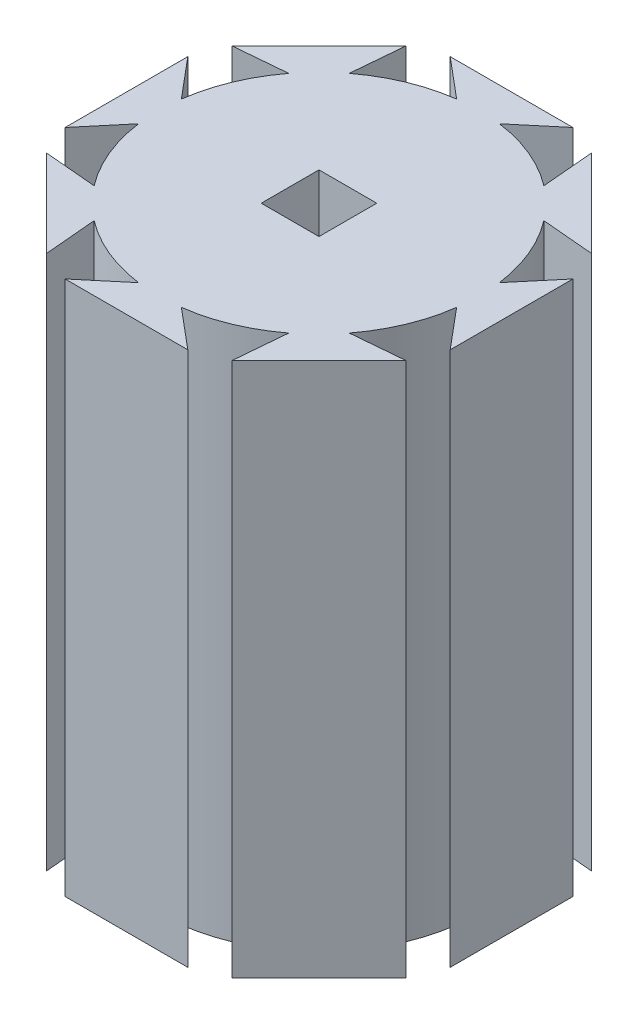
ISO-10303-21;
HEADER;
FILE_DESCRIPTION(('STEP AP214'),'2;1');
FILE_NAME('part.step','',(''),(''),'','','');
FILE_SCHEMA(('AUTOMOTIVE_DESIGN { 1 0 10303 214 1 1 1 1 }'));
ENDSEC;
DATA;
#1=APPLICATION_CONTEXT('core data for automotive mechanical design processes');
#2=APPLICATION_PROTOCOL_DEFINITION('international standard','automotive_design',2000,#1);
#3=PRODUCT_CONTEXT('',#1,'mechanical');
#4=PRODUCT('Part','Part','',(#3));
#5=PRODUCT_RELATED_PRODUCT_CATEGORY('part','',(#4));
#6=PRODUCT_DEFINITION_FORMATION('','',#4);
#7=PRODUCT_DEFINITION_CONTEXT('part definition',#1,'design');
#8=PRODUCT_DEFINITION('design','',#6,#7);
#9=PRODUCT_DEFINITION_SHAPE('','',#8);
#10=(LENGTH_UNIT() NAMED_UNIT(*) SI_UNIT(.MILLI.,.METRE.));
#11=(NAMED_UNIT(*) PLANE_ANGLE_UNIT() SI_UNIT($,.RADIAN.));
#12=(NAMED_UNIT(*) SI_UNIT($,.STERADIAN.) SOLID_ANGLE_UNIT());
#13=UNCERTAINTY_MEASURE_WITH_UNIT(LENGTH_MEASURE(1.E-05),#10,'distance_accuracy_value','');
#14=(GEOMETRIC_REPRESENTATION_CONTEXT(3) GLOBAL_UNCERTAINTY_ASSIGNED_CONTEXT((#13)) GLOBAL_UNIT_ASSIGNED_CONTEXT((#10,
#11,#12)) REPRESENTATION_CONTEXT('',''));
#15=CARTESIAN_POINT('',(0.,0.,0.));
#16=DIRECTION('',(0.,0.,1.));
#17=DIRECTION('',(1.,0.,0.));
#18=AXIS2_PLACEMENT_3D('',#15,#16,#17);
#19=CARTESIAN_POINT('',(0.,63.5,0.));
#20=DIRECTION('',(0.,-1.,0.));
#21=DIRECTION('',(0.,0.,-1.));
#22=AXIS2_PLACEMENT_3D('',#19,#20,#21);
#23=CYLINDRICAL_SURFACE('',#22,19.05);
#24=DIRECTION('',(0.,-1.,0.));
#25=VECTOR('',#24,1.);
#26=CARTESIAN_POINT('',(-15.1461617106479,78.0665795264893,-11.5540592622205));
#27=LINE('',#26,#25);
#28=CARTESIAN_POINT('',(-15.1461617106479,63.5,-11.5540592622205));
#29=VERTEX_POINT('',#28);
#30=CARTESIAN_POINT('',(-15.1461617106479,0.,-11.5540592622205));
#31=VERTEX_POINT('',#30);
#32=EDGE_CURVE('E70',#29,#31,#27,.T.);
#33=ORIENTED_EDGE('',*,*,#32,.T.);
#34=CARTESIAN_POINT('',(0.,0.,0.));
#35=DIRECTION('',(0.,1.,0.));
#36=DIRECTION('',(0.,0.,1.));
#37=AXIS2_PLACEMENT_3D('',#34,#35,#36);
#38=CIRCLE('',#37,19.05);
#39=CARTESIAN_POINT('',(-18.8799073090945,0.,-2.5400000000002));
#40=VERTEX_POINT('',#39);
#41=EDGE_CURVE('E630',#31,#40,#38,.T.);
#42=ORIENTED_EDGE('',*,*,#41,.T.);
#43=DIRECTION('',(0.,-1.,0.));
#44=VECTOR('',#43,1.);
#45=CARTESIAN_POINT('',(-18.8799073090945,78.6005422727045,-2.5400000000002));
#46=LINE('',#45,#44);
#47=CARTESIAN_POINT('',(-18.8799073090945,63.5,-2.5400000000002));
#48=VERTEX_POINT('',#47);
#49=EDGE_CURVE('E346',#48,#40,#46,.T.);
#50=ORIENTED_EDGE('',*,*,#49,.F.);
#51=CARTESIAN_POINT('',(0.,63.5,0.));
#52=DIRECTION('',(0.,1.,0.));
#53=DIRECTION('',(0.,0.,1.));
#54=AXIS2_PLACEMENT_3D('',#51,#52,#53);
#55=CIRCLE('',#54,19.05);
#56=EDGE_CURVE('E55',#29,#48,#55,.T.);
#57=ORIENTED_EDGE('',*,*,#56,.F.);
#58=EDGE_LOOP('',(#33,#42,#50,#57));
#59=FACE_BOUND('',#58,.T.);
#60=ADVANCED_FACE('F45',(#59),#23,.T.);
#61=DIRECTION('',(0.,-1.,0.));
#62=VECTOR('',#61,1.);
#63=CARTESIAN_POINT('',(-18.8799073090945,78.6005422727045,2.5399999999998));
#64=LINE('',#63,#62);
#65=CARTESIAN_POINT('',(-18.8799073090945,63.5,2.5399999999998));
#66=VERTEX_POINT('',#65);
#67=CARTESIAN_POINT('',(-18.8799073090945,0.,2.5399999999998));
#68=VERTEX_POINT('',#67);
#69=EDGE_CURVE('E354',#66,#68,#64,.T.);
#70=ORIENTED_EDGE('',*,*,#69,.T.);
#71=CARTESIAN_POINT('',(-15.1461617106481,0.,11.5540592622202));
#72=VERTEX_POINT('',#71);
#73=EDGE_CURVE('E634',#68,#72,#38,.T.);
#74=ORIENTED_EDGE('',*,*,#73,.T.);
#75=DIRECTION('',(0.,-1.,0.));
#76=VECTOR('',#75,1.);
#77=CARTESIAN_POINT('',(-15.1461617106481,78.0665795264893,11.5540592622202));
#78=LINE('',#77,#76);
#79=CARTESIAN_POINT('',(-15.1461617106481,63.5,11.5540592622202));
#80=VERTEX_POINT('',#79);
#81=EDGE_CURVE('E382',#80,#72,#78,.T.);
#82=ORIENTED_EDGE('',*,*,#81,.F.);
#83=EDGE_CURVE('E757',#66,#80,#55,.T.);
#84=ORIENTED_EDGE('',*,*,#83,.F.);
#85=EDGE_LOOP('',(#70,#74,#82,#84));
#86=FACE_BOUND('',#85,.T.);
#87=ADVANCED_FACE('F721',(#86),#23,.T.);
#88=DIRECTION('',(0.,-1.,0.));
#89=VECTOR('',#88,1.);
#90=CARTESIAN_POINT('',(-11.5540592622205,78.0665795264893,15.1461617106479));
#91=LINE('',#90,#89);
#92=CARTESIAN_POINT('',(-11.5540592622205,63.5,15.1461617106479));
#93=VERTEX_POINT('',#92);
#94=CARTESIAN_POINT('',(-11.5540592622205,0.,15.1461617106479));
#95=VERTEX_POINT('',#94);
#96=EDGE_CURVE('E390',#93,#95,#91,.T.);
#97=ORIENTED_EDGE('',*,*,#96,.T.);
#98=CARTESIAN_POINT('',(-2.54,0.,18.8799073090945));
#99=VERTEX_POINT('',#98);
#100=EDGE_CURVE('E637',#95,#99,#38,.T.);
#101=ORIENTED_EDGE('',*,*,#100,.T.);
#102=DIRECTION('',(0.,-1.,0.));
#103=VECTOR('',#102,1.);
#104=CARTESIAN_POINT('',(-2.54,78.6005422727045,18.8799073090945));
#105=LINE('',#104,#103);
#106=CARTESIAN_POINT('',(-2.54,63.5,18.8799073090945));
#107=VERTEX_POINT('',#106);
#108=EDGE_CURVE('E418',#107,#99,#105,.T.);
#109=ORIENTED_EDGE('',*,*,#108,.F.);
#110=EDGE_CURVE('E679',#93,#107,#55,.T.);
#111=ORIENTED_EDGE('',*,*,#110,.F.);
#112=EDGE_LOOP('',(#97,#101,#109,#111));
#113=FACE_BOUND('',#112,.T.);
#114=ADVANCED_FACE('F735',(#113),#23,.T.);
#115=DIRECTION('',(0.,-1.,0.));
#116=VECTOR('',#115,1.);
#117=CARTESIAN_POINT('',(2.54,78.6005422727045,18.8799073090945));
#118=LINE('',#117,#116);
#119=CARTESIAN_POINT('',(2.54,63.5,18.8799073090945));
#120=VERTEX_POINT('',#119);
#121=CARTESIAN_POINT('',(2.54,0.,18.8799073090945));
#122=VERTEX_POINT('',#121);
#123=EDGE_CURVE('E426',#120,#122,#118,.T.);
#124=ORIENTED_EDGE('',*,*,#123,.T.);
#125=CARTESIAN_POINT('',(11.5540592622203,0.,15.1461617106481));
#126=VERTEX_POINT('',#125);
#127=EDGE_CURVE('E642',#122,#126,#38,.T.);
#128=ORIENTED_EDGE('',*,*,#127,.T.);
#129=DIRECTION('',(0.,-1.,0.));
#130=VECTOR('',#129,1.);
#131=CARTESIAN_POINT('',(11.5540592622203,78.0665795264893,15.1461617106481));
#132=LINE('',#131,#130);
#133=CARTESIAN_POINT('',(11.5540592622203,63.5,15.1461617106481));
#134=VERTEX_POINT('',#133);
#135=EDGE_CURVE('E454',#134,#126,#132,.T.);
#136=ORIENTED_EDGE('',*,*,#135,.F.);
#137=EDGE_CURVE('E676',#120,#134,#55,.T.);
#138=ORIENTED_EDGE('',*,*,#137,.F.);
#139=EDGE_LOOP('',(#124,#128,#136,#138));
#140=FACE_BOUND('',#139,.T.);
#141=ADVANCED_FACE('F731',(#140),#23,.T.);
#142=DIRECTION('',(0.,-1.,0.));
#143=VECTOR('',#142,1.);
#144=CARTESIAN_POINT('',(15.146161710648,78.0665795264893,11.5540592622204));
#145=LINE('',#144,#143);
#146=CARTESIAN_POINT('',(15.146161710648,63.5,11.5540592622204));
#147=VERTEX_POINT('',#146);
#148=CARTESIAN_POINT('',(15.146161710648,0.,11.5540592622204));
#149=VERTEX_POINT('',#148);
#150=EDGE_CURVE('E462',#147,#149,#145,.T.);
#151=ORIENTED_EDGE('',*,*,#150,.T.);
#152=CARTESIAN_POINT('',(18.8799073090945,0.,2.54000000000007));
#153=VERTEX_POINT('',#152);
#154=EDGE_CURVE('E628',#149,#153,#38,.T.);
#155=ORIENTED_EDGE('',*,*,#154,.T.);
#156=DIRECTION('',(0.,-1.,0.));
#157=VECTOR('',#156,1.);
#158=CARTESIAN_POINT('',(18.8799073090945,78.6005422727045,2.54000000000007));
#159=LINE('',#158,#157);
#160=CARTESIAN_POINT('',(18.8799073090945,63.5,2.54000000000007));
#161=VERTEX_POINT('',#160);
#162=EDGE_CURVE('E490',#161,#153,#159,.T.);
#163=ORIENTED_EDGE('',*,*,#162,.F.);
#164=EDGE_CURVE('E673',#147,#161,#55,.T.);
#165=ORIENTED_EDGE('',*,*,#164,.F.);
#166=EDGE_LOOP('',(#151,#155,#163,#165));
#167=FACE_BOUND('',#166,.T.);
#168=ADVANCED_FACE('F654',(#167),#23,.T.);
#169=DIRECTION('',(0.,-1.,0.));
#170=VECTOR('',#169,1.);
#171=CARTESIAN_POINT('',(18.8799073090945,78.6005422727045,-2.53999999999994));
#172=LINE('',#171,#170);
#173=CARTESIAN_POINT('',(18.8799073090945,63.5,-2.53999999999994));
#174=VERTEX_POINT('',#173);
#175=CARTESIAN_POINT('',(18.8799073090945,0.,-2.53999999999994));
#176=VERTEX_POINT('',#175);
#177=EDGE_CURVE('E498',#174,#176,#172,.T.);
#178=ORIENTED_EDGE('',*,*,#177,.T.);
#179=CARTESIAN_POINT('',(15.146161710648,0.,-11.5540592622203));
#180=VERTEX_POINT('',#179);
#181=EDGE_CURVE('E623',#176,#180,#38,.T.);
#182=ORIENTED_EDGE('',*,*,#181,.T.);
#183=DIRECTION('',(0.,-1.,0.));
#184=VECTOR('',#183,1.);
#185=CARTESIAN_POINT('',(15.146161710648,78.0665795264893,-11.5540592622203));
#186=LINE('',#185,#184);
#187=CARTESIAN_POINT('',(15.146161710648,63.5,-11.5540592622203));
#188=VERTEX_POINT('',#187);
#189=EDGE_CURVE('E526',#188,#180,#186,.T.);
#190=ORIENTED_EDGE('',*,*,#189,.F.);
#191=EDGE_CURVE('E633',#174,#188,#55,.T.);
#192=ORIENTED_EDGE('',*,*,#191,.F.);
#193=EDGE_LOOP('',(#178,#182,#190,#192));
#194=FACE_BOUND('',#193,.T.);
#195=ADVANCED_FACE('F683',(#194),#23,.T.);
#196=DIRECTION('',(0.,-1.,0.));
#197=VECTOR('',#196,1.);
#198=CARTESIAN_POINT('',(11.5540592622204,78.0665795264893,-15.146161710648));
#199=LINE('',#198,#197);
#200=CARTESIAN_POINT('',(11.5540592622204,63.5,-15.146161710648));
#201=VERTEX_POINT('',#200);
#202=CARTESIAN_POINT('',(11.5540592622204,0.,-15.146161710648));
#203=VERTEX_POINT('',#202);
#204=EDGE_CURVE('E534',#201,#203,#199,.T.);
#205=ORIENTED_EDGE('',*,*,#204,.T.);
#206=CARTESIAN_POINT('',(2.54,0.,-18.8799073090945));
#207=VERTEX_POINT('',#206);
#208=EDGE_CURVE('E619',#203,#207,#38,.T.);
#209=ORIENTED_EDGE('',*,*,#208,.T.);
#210=DIRECTION('',(0.,-1.,0.));
#211=VECTOR('',#210,1.);
#212=CARTESIAN_POINT('',(2.54,78.6005422727045,-18.8799073090945));
#213=LINE('',#212,#211);
#214=CARTESIAN_POINT('',(2.54,63.5,-18.8799073090945));
#215=VERTEX_POINT('',#214);
#216=EDGE_CURVE('E562',#215,#207,#213,.T.);
#217=ORIENTED_EDGE('',*,*,#216,.F.);
#218=EDGE_CURVE('E56',#201,#215,#55,.T.);
#219=ORIENTED_EDGE('',*,*,#218,.F.);
#220=EDGE_LOOP('',(#205,#209,#217,#219));
#221=FACE_BOUND('',#220,.T.);
#222=ADVANCED_FACE('F698',(#221),#23,.T.);
#223=CARTESIAN_POINT('',(0.,63.5,0.));
#224=DIRECTION('',(0.,1.,0.));
#225=DIRECTION('',(0.,0.,1.));
#226=AXIS2_PLACEMENT_3D('',#223,#224,#225);
#227=PLANE('',#226);
#228=CARTESIAN_POINT('',(-2.54,63.5,-18.8799073090945));
#229=VERTEX_POINT('',#228);
#230=CARTESIAN_POINT('',(-11.5540592622202,63.5,-15.1461617106482));
#231=VERTEX_POINT('',#230);
#232=EDGE_CURVE('E11',#229,#231,#55,.T.);
#233=ORIENTED_EDGE('',*,*,#232,.T.);
#234=DIRECTION('',(-0.0871557427476764,0.,0.996194698091744));
#235=VECTOR('',#234,1.);
#236=CARTESIAN_POINT('',(-12.7813448910601,63.5,-1.11822278258298));
#237=LINE('',#236,#235);
#238=CARTESIAN_POINT('',(-11.0143974369874,63.5,-21.3145245988614));
#239=VERTEX_POINT('',#238);
#240=EDGE_CURVE('E306',#239,#231,#237,.T.);
#241=ORIENTED_EDGE('',*,*,#240,.F.);
#242=DIRECTION('',(-0.707106781186556,0.,0.707106781186539));
#243=VECTOR('',#242,1.);
#244=CARTESIAN_POINT('',(-16.1644610179243,63.5,-16.1644610179247));
#245=LINE('',#244,#243);
#246=CARTESIAN_POINT('',(-21.3145245988612,63.5,-11.0143974369879));
#247=VERTEX_POINT('',#246);
#248=EDGE_CURVE('E286',#239,#247,#245,.T.);
#249=ORIENTED_EDGE('',*,*,#248,.T.);
#250=DIRECTION('',(0.996194698091746,0.,-0.0871557427476522));
#251=VECTOR('',#250,1.);
#252=CARTESIAN_POINT('',(-1.11822278258267,63.5,-12.7813448910602));
#253=LINE('',#252,#251);
#254=EDGE_CURVE('E307',#247,#29,#253,.T.);
#255=ORIENTED_EDGE('',*,*,#254,.T.);
#256=ORIENTED_EDGE('',*,*,#56,.T.);
#257=DIRECTION('',(0.642787609686527,0.,0.766044443118989));
#258=VECTOR('',#257,1.);
#259=CARTESIAN_POINT('',(-9.82847855759436,63.5,8.24707273271096));
#260=LINE('',#259,#258);
#261=CARTESIAN_POINT('',(-22.8599999999999,63.5,-7.28328976324487));
#262=VERTEX_POINT('',#261);
#263=EDGE_CURVE('E330',#262,#48,#260,.T.);
#264=ORIENTED_EDGE('',*,*,#263,.F.);
#265=DIRECTION('',(0.,0.,1.));
#266=VECTOR('',#265,1.);
#267=CARTESIAN_POINT('',(-22.86,63.5,-2.39445790217862E-13));
#268=LINE('',#267,#266);
#269=CARTESIAN_POINT('',(-22.8600000000001,63.5,7.28328976324439));
#270=VERTEX_POINT('',#269);
#271=EDGE_CURVE('E302',#262,#270,#268,.T.);
#272=ORIENTED_EDGE('',*,*,#271,.T.);
#273=DIRECTION('',(0.642787609686543,0.,-0.766044443118975));
#274=VECTOR('',#273,1.);
#275=CARTESIAN_POINT('',(-9.82847855759419,63.5,-8.24707273271116));
#276=LINE('',#275,#274);
#277=EDGE_CURVE('E331',#270,#66,#276,.T.);
#278=ORIENTED_EDGE('',*,*,#277,.T.);
#279=ORIENTED_EDGE('',*,*,#83,.T.);
#280=DIRECTION('',(0.996194698091744,0.,0.087155742747673));
#281=VECTOR('',#280,1.);
#282=CARTESIAN_POINT('',(-1.11822278258294,63.5,12.7813448910601));
#283=LINE('',#282,#281);
#284=CARTESIAN_POINT('',(-21.3145245988614,63.5,11.0143974369874));
#285=VERTEX_POINT('',#284);
#286=EDGE_CURVE('E366',#285,#80,#283,.T.);
#287=ORIENTED_EDGE('',*,*,#286,.F.);
#288=DIRECTION('',(0.707106781186541,0.,0.707106781186554));
#289=VECTOR('',#288,1.);
#290=CARTESIAN_POINT('',(-16.1644610179246,63.5,16.1644610179243));
#291=LINE('',#290,#289);
#292=CARTESIAN_POINT('',(-11.0143974369878,63.5,21.3145245988612));
#293=VERTEX_POINT('',#292);
#294=EDGE_CURVE('E342',#285,#293,#291,.T.);
#295=ORIENTED_EDGE('',*,*,#294,.T.);
#296=DIRECTION('',(-0.0871557427476557,0.,-0.996194698091746));
#297=VECTOR('',#296,1.);
#298=CARTESIAN_POINT('',(-12.7813448910602,63.5,1.11822278258272));
#299=LINE('',#298,#297);
#300=EDGE_CURVE('E367',#293,#93,#299,.T.);
#301=ORIENTED_EDGE('',*,*,#300,.T.);
#302=ORIENTED_EDGE('',*,*,#110,.T.);
#303=DIRECTION('',(0.766044443118982,0.,-0.642787609686535));
#304=VECTOR('',#303,1.);
#305=CARTESIAN_POINT('',(8.24707273271106,63.5,9.82847855759428));
#306=LINE('',#305,#304);
#307=CARTESIAN_POINT('',(-7.28328976324463,63.5,22.86));
#308=VERTEX_POINT('',#307);
#309=EDGE_CURVE('E402',#308,#107,#306,.T.);
#310=ORIENTED_EDGE('',*,*,#309,.F.);
#311=DIRECTION('',(1.,0.,0.));
#312=VECTOR('',#311,1.);
#313=CARTESIAN_POINT('',(0.,63.5,22.86));
#314=LINE('',#313,#312);
#315=CARTESIAN_POINT('',(7.28328976324463,63.5,22.86));
#316=VERTEX_POINT('',#315);
#317=EDGE_CURVE('E378',#308,#316,#314,.T.);
#318=ORIENTED_EDGE('',*,*,#317,.T.);
#319=DIRECTION('',(-0.766044443118982,0.,-0.642787609686535));
#320=VECTOR('',#319,1.);
#321=CARTESIAN_POINT('',(-8.24707273271106,63.5,9.82847855759428));
#322=LINE('',#321,#320);
#323=EDGE_CURVE('E403',#316,#120,#322,.T.);
#324=ORIENTED_EDGE('',*,*,#323,.T.);
#325=ORIENTED_EDGE('',*,*,#137,.T.);
#326=DIRECTION('',(0.0871557427476696,0.,-0.996194698091745));
#327=VECTOR('',#326,1.);
#328=CARTESIAN_POINT('',(12.7813448910601,63.5,1.1182227825829));
#329=LINE('',#328,#327);
#330=CARTESIAN_POINT('',(11.0143974369875,63.5,21.3145245988614));
#331=VERTEX_POINT('',#330);
#332=EDGE_CURVE('E438',#331,#134,#329,.T.);
#333=ORIENTED_EDGE('',*,*,#332,.F.);
#334=DIRECTION('',(0.707106781186551,0.,-0.707106781186544));
#335=VECTOR('',#334,1.);
#336=CARTESIAN_POINT('',(16.1644610179244,63.5,16.1644610179246));
#337=LINE('',#336,#335);
#338=CARTESIAN_POINT('',(21.3145245988613,63.5,11.0143974369877));
#339=VERTEX_POINT('',#338);
#340=EDGE_CURVE('E414',#331,#339,#337,.T.);
#341=ORIENTED_EDGE('',*,*,#340,.T.);
#342=DIRECTION('',(-0.996194698091745,0.,0.087155742747659));
#343=VECTOR('',#342,1.);
#344=CARTESIAN_POINT('',(1.11822278258276,63.5,12.7813448910602));
#345=LINE('',#344,#343);
#346=EDGE_CURVE('E439',#339,#147,#345,.T.);
#347=ORIENTED_EDGE('',*,*,#346,.T.);
#348=ORIENTED_EDGE('',*,*,#164,.T.);
#349=DIRECTION('',(-0.642787609686532,0.,-0.766044443118984));
#350=VECTOR('',#349,1.);
#351=CARTESIAN_POINT('',(9.8284785575943,63.5,-8.24707273271102));
#352=LINE('',#351,#350);
#353=CARTESIAN_POINT('',(22.86,63.5,7.28328976324471));
#354=VERTEX_POINT('',#353);
#355=EDGE_CURVE('E474',#354,#161,#352,.T.);
#356=ORIENTED_EDGE('',*,*,#355,.F.);
#357=DIRECTION('',(0.,0.,-1.));
#358=VECTOR('',#357,1.);
#359=CARTESIAN_POINT('',(22.86,63.5,0.));
#360=LINE('',#359,#358);
#361=CARTESIAN_POINT('',(22.86,63.5,-7.28328976324455));
#362=VERTEX_POINT('',#361);
#363=EDGE_CURVE('E450',#354,#362,#360,.T.);
#364=ORIENTED_EDGE('',*,*,#363,.T.);
#365=DIRECTION('',(-0.642787609686537,0.,0.76604444311898));
#366=VECTOR('',#365,1.);
#367=CARTESIAN_POINT('',(9.82847855759425,63.5,8.24707273271109));
#368=LINE('',#367,#366);
#369=EDGE_CURVE('E475',#362,#174,#368,.T.);
#370=ORIENTED_EDGE('',*,*,#369,.T.);
#371=ORIENTED_EDGE('',*,*,#191,.T.);
#372=DIRECTION('',(-0.996194698091745,0.,-0.0871557427476661));
#373=VECTOR('',#372,1.);
#374=CARTESIAN_POINT('',(1.11822278258285,63.5,-12.7813448910601));
#375=LINE('',#374,#373);
#376=CARTESIAN_POINT('',(21.3145245988613,63.5,-11.0143974369876));
#377=VERTEX_POINT('',#376);
#378=EDGE_CURVE('E510',#377,#188,#375,.T.);
#379=ORIENTED_EDGE('',*,*,#378,.F.);
#380=DIRECTION('',(-0.707106781186546,0.,-0.707106781186549));
#381=VECTOR('',#380,1.);
#382=CARTESIAN_POINT('',(16.1644610179245,63.5,-16.1644610179244));
#383=LINE('',#382,#381);
#384=CARTESIAN_POINT('',(11.0143974369877,63.5,-21.3145245988613));
#385=VERTEX_POINT('',#384);
#386=EDGE_CURVE('E486',#377,#385,#383,.T.);
#387=ORIENTED_EDGE('',*,*,#386,.T.);
#388=DIRECTION('',(0.0871557427476626,0.,0.996194698091745));
#389=VECTOR('',#388,1.);
#390=CARTESIAN_POINT('',(12.7813448910602,63.5,-1.11822278258281));
#391=LINE('',#390,#389);
#392=EDGE_CURVE('E511',#385,#201,#391,.T.);
#393=ORIENTED_EDGE('',*,*,#392,.T.);
#394=ORIENTED_EDGE('',*,*,#218,.T.);
#395=DIRECTION('',(-0.766044443118982,0.,0.642787609686535));
#396=VECTOR('',#395,1.);
#397=CARTESIAN_POINT('',(-8.24707273271106,63.5,-9.82847855759428));
#398=LINE('',#397,#396);
#399=CARTESIAN_POINT('',(7.28328976324463,63.5,-22.86));
#400=VERTEX_POINT('',#399);
#401=EDGE_CURVE('E546',#400,#215,#398,.T.);
#402=ORIENTED_EDGE('',*,*,#401,.F.);
#403=DIRECTION('',(-1.,0.,0.));
#404=VECTOR('',#403,1.);
#405=CARTESIAN_POINT('',(0.,63.5,-22.86));
#406=LINE('',#405,#404);
#407=CARTESIAN_POINT('',(-7.28328976324463,63.5,-22.86));
#408=VERTEX_POINT('',#407);
#409=EDGE_CURVE('E522',#400,#408,#406,.T.);
#410=ORIENTED_EDGE('',*,*,#409,.T.);
#411=DIRECTION('',(0.766044443118982,0.,0.642787609686535));
#412=VECTOR('',#411,1.);
#413=CARTESIAN_POINT('',(8.24707273271106,63.5,-9.82847855759428));
#414=LINE('',#413,#412);
#415=EDGE_CURVE('E547',#408,#229,#414,.T.);
#416=ORIENTED_EDGE('',*,*,#415,.T.);
#417=EDGE_LOOP('',(#233,#241,#249,#255,#256,#264,#272,#278,#279,#287,#295,#301,#302,#310,#318,
#324,#325,#333,#341,#347,#348,#356,#364,#370,#371,#379,#387,#393,#394,#402,#410,#416));
#418=FACE_BOUND('',#417,.T.);
#419=DIRECTION('',(-1.,0.,0.));
#420=VECTOR('',#419,1.);
#421=CARTESIAN_POINT('',(-3.429,63.5,-3.429));
#422=LINE('',#421,#420);
#423=CARTESIAN_POINT('',(3.429,63.5,-3.429));
#424=VERTEX_POINT('',#423);
#425=CARTESIAN_POINT('',(-3.429,63.5,-3.429));
#426=VERTEX_POINT('',#425);
#427=EDGE_CURVE('E581',#424,#426,#422,.T.);
#428=ORIENTED_EDGE('',*,*,#427,.F.);
#429=DIRECTION('',(0.,0.,-1.));
#430=VECTOR('',#429,1.);
#431=CARTESIAN_POINT('',(3.429,63.5,3.429));
#432=LINE('',#431,#430);
#433=CARTESIAN_POINT('',(3.429,63.5,3.429));
#434=VERTEX_POINT('',#433);
#435=EDGE_CURVE('E578',#434,#424,#432,.T.);
#436=ORIENTED_EDGE('',*,*,#435,.F.);
#437=DIRECTION('',(1.,0.,0.));
#438=VECTOR('',#437,1.);
#439=CARTESIAN_POINT('',(-3.429,63.5,3.429));
#440=LINE('',#439,#438);
#441=CARTESIAN_POINT('',(-3.429,63.5,3.429));
#442=VERTEX_POINT('',#441);
#443=EDGE_CURVE('E589',#442,#434,#440,.T.);
#444=ORIENTED_EDGE('',*,*,#443,.F.);
#445=DIRECTION('',(0.,0.,1.));
#446=VECTOR('',#445,1.);
#447=CARTESIAN_POINT('',(-3.429,63.5,3.429));
#448=LINE('',#447,#446);
#449=EDGE_CURVE('E585',#426,#442,#448,.T.);
#450=ORIENTED_EDGE('',*,*,#449,.F.);
#451=EDGE_LOOP('',(#428,#436,#444,#450));
#452=FACE_BOUND('',#451,.T.);
#453=ADVANCED_FACE('F670',(#418,#452),#227,.T.);
#454=CARTESIAN_POINT('',(0.,0.,0.));
#455=DIRECTION('',(0.,1.,0.));
#456=DIRECTION('',(0.,0.,1.));
#457=AXIS2_PLACEMENT_3D('',#454,#455,#456);
#458=PLANE('',#457);
#459=CARTESIAN_POINT('',(-2.54,0.,-18.8799073090945));
#460=VERTEX_POINT('',#459);
#461=CARTESIAN_POINT('',(-11.5540592622202,0.,-15.1461617106482));
#462=VERTEX_POINT('',#461);
#463=EDGE_CURVE('E49',#460,#462,#38,.T.);
#464=ORIENTED_EDGE('',*,*,#463,.F.);
#465=DIRECTION('',(0.766044443118982,0.,0.642787609686535));
#466=VECTOR('',#465,1.);
#467=CARTESIAN_POINT('',(8.24707273271106,0.,-9.82847855759428));
#468=LINE('',#467,#466);
#469=CARTESIAN_POINT('',(-7.28328976324463,0.,-22.86));
#470=VERTEX_POINT('',#469);
#471=EDGE_CURVE('E548',#470,#460,#468,.T.);
#472=ORIENTED_EDGE('',*,*,#471,.F.);
#473=DIRECTION('',(-1.,0.,0.));
#474=VECTOR('',#473,1.);
#475=CARTESIAN_POINT('',(0.,0.,-22.86));
#476=LINE('',#475,#474);
#477=CARTESIAN_POINT('',(7.28328976324463,0.,-22.86));
#478=VERTEX_POINT('',#477);
#479=EDGE_CURVE('E554',#478,#470,#476,.T.);
#480=ORIENTED_EDGE('',*,*,#479,.F.);
#481=DIRECTION('',(-0.766044443118982,0.,0.642787609686535));
#482=VECTOR('',#481,1.);
#483=CARTESIAN_POINT('',(-8.24707273271106,0.,-9.82847855759428));
#484=LINE('',#483,#482);
#485=EDGE_CURVE('E542',#478,#207,#484,.T.);
#486=ORIENTED_EDGE('',*,*,#485,.T.);
#487=ORIENTED_EDGE('',*,*,#208,.F.);
#488=DIRECTION('',(0.0871557427476626,0.,0.996194698091745));
#489=VECTOR('',#488,1.);
#490=CARTESIAN_POINT('',(12.7813448910602,0.,-1.11822278258281));
#491=LINE('',#490,#489);
#492=CARTESIAN_POINT('',(11.0143974369877,0.,-21.3145245988613));
#493=VERTEX_POINT('',#492);
#494=EDGE_CURVE('E512',#493,#203,#491,.T.);
#495=ORIENTED_EDGE('',*,*,#494,.F.);
#496=DIRECTION('',(-0.707106781186546,0.,-0.707106781186549));
#497=VECTOR('',#496,1.);
#498=CARTESIAN_POINT('',(16.1644610179245,0.,-16.1644610179244));
#499=LINE('',#498,#497);
#500=CARTESIAN_POINT('',(21.3145245988613,0.,-11.0143974369876));
#501=VERTEX_POINT('',#500);
#502=EDGE_CURVE('E518',#501,#493,#499,.T.);
#503=ORIENTED_EDGE('',*,*,#502,.F.);
#504=DIRECTION('',(-0.996194698091745,0.,-0.0871557427476661));
#505=VECTOR('',#504,1.);
#506=CARTESIAN_POINT('',(1.11822278258285,0.,-12.7813448910601));
#507=LINE('',#506,#505);
#508=EDGE_CURVE('E506',#501,#180,#507,.T.);
#509=ORIENTED_EDGE('',*,*,#508,.T.);
#510=ORIENTED_EDGE('',*,*,#181,.F.);
#511=DIRECTION('',(-0.642787609686537,0.,0.76604444311898));
#512=VECTOR('',#511,1.);
#513=CARTESIAN_POINT('',(9.82847855759425,0.,8.24707273271109));
#514=LINE('',#513,#512);
#515=CARTESIAN_POINT('',(22.86,0.,-7.28328976324455));
#516=VERTEX_POINT('',#515);
#517=EDGE_CURVE('E476',#516,#176,#514,.T.);
#518=ORIENTED_EDGE('',*,*,#517,.F.);
#519=DIRECTION('',(0.,0.,-1.));
#520=VECTOR('',#519,1.);
#521=CARTESIAN_POINT('',(22.86,0.,0.));
#522=LINE('',#521,#520);
#523=CARTESIAN_POINT('',(22.86,0.,7.28328976324471));
#524=VERTEX_POINT('',#523);
#525=EDGE_CURVE('E482',#524,#516,#522,.T.);
#526=ORIENTED_EDGE('',*,*,#525,.F.);
#527=DIRECTION('',(-0.642787609686532,0.,-0.766044443118984));
#528=VECTOR('',#527,1.);
#529=CARTESIAN_POINT('',(9.8284785575943,0.,-8.24707273271102));
#530=LINE('',#529,#528);
#531=EDGE_CURVE('E470',#524,#153,#530,.T.);
#532=ORIENTED_EDGE('',*,*,#531,.T.);
#533=ORIENTED_EDGE('',*,*,#154,.F.);
#534=DIRECTION('',(-0.996194698091746,0.,0.087155742747659));
#535=VECTOR('',#534,1.);
#536=CARTESIAN_POINT('',(1.11822278258276,0.,12.7813448910602));
#537=LINE('',#536,#535);
#538=CARTESIAN_POINT('',(21.3145245988613,0.,11.0143974369877));
#539=VERTEX_POINT('',#538);
#540=EDGE_CURVE('E440',#539,#149,#537,.T.);
#541=ORIENTED_EDGE('',*,*,#540,.F.);
#542=DIRECTION('',(0.707106781186551,0.,-0.707106781186544));
#543=VECTOR('',#542,1.);
#544=CARTESIAN_POINT('',(16.1644610179244,0.,16.1644610179246));
#545=LINE('',#544,#543);
#546=CARTESIAN_POINT('',(11.0143974369875,0.,21.3145245988614));
#547=VERTEX_POINT('',#546);
#548=EDGE_CURVE('E446',#547,#539,#545,.T.);
#549=ORIENTED_EDGE('',*,*,#548,.F.);
#550=DIRECTION('',(0.0871557427476696,0.,-0.996194698091745));
#551=VECTOR('',#550,1.);
#552=CARTESIAN_POINT('',(12.7813448910601,0.,1.1182227825829));
#553=LINE('',#552,#551);
#554=EDGE_CURVE('E434',#547,#126,#553,.T.);
#555=ORIENTED_EDGE('',*,*,#554,.T.);
#556=ORIENTED_EDGE('',*,*,#127,.F.);
#557=DIRECTION('',(-0.766044443118982,0.,-0.642787609686535));
#558=VECTOR('',#557,1.);
#559=CARTESIAN_POINT('',(-8.24707273271106,0.,9.82847855759428));
#560=LINE('',#559,#558);
#561=CARTESIAN_POINT('',(7.28328976324463,0.,22.86));
#562=VERTEX_POINT('',#561);
#563=EDGE_CURVE('E404',#562,#122,#560,.T.);
#564=ORIENTED_EDGE('',*,*,#563,.F.);
#565=DIRECTION('',(1.,0.,0.));
#566=VECTOR('',#565,1.);
#567=CARTESIAN_POINT('',(0.,0.,22.86));
#568=LINE('',#567,#566);
#569=CARTESIAN_POINT('',(-7.28328976324463,0.,22.86));
#570=VERTEX_POINT('',#569);
#571=EDGE_CURVE('E410',#570,#562,#568,.T.);
#572=ORIENTED_EDGE('',*,*,#571,.F.);
#573=DIRECTION('',(0.766044443118982,0.,-0.642787609686535));
#574=VECTOR('',#573,1.);
#575=CARTESIAN_POINT('',(8.24707273271106,0.,9.82847855759428));
#576=LINE('',#575,#574);
#577=EDGE_CURVE('E398',#570,#99,#576,.T.);
#578=ORIENTED_EDGE('',*,*,#577,.T.);
#579=ORIENTED_EDGE('',*,*,#100,.F.);
#580=DIRECTION('',(-0.0871557427476557,0.,-0.996194698091746));
#581=VECTOR('',#580,1.);
#582=CARTESIAN_POINT('',(-12.7813448910602,0.,1.11822278258272));
#583=LINE('',#582,#581);
#584=CARTESIAN_POINT('',(-11.0143974369878,0.,21.3145245988612));
#585=VERTEX_POINT('',#584);
#586=EDGE_CURVE('E368',#585,#95,#583,.T.);
#587=ORIENTED_EDGE('',*,*,#586,.F.);
#588=DIRECTION('',(0.707106781186541,0.,0.707106781186554));
#589=VECTOR('',#588,1.);
#590=CARTESIAN_POINT('',(-16.1644610179246,0.,16.1644610179243));
#591=LINE('',#590,#589);
#592=CARTESIAN_POINT('',(-21.3145245988614,0.,11.0143974369874));
#593=VERTEX_POINT('',#592);
#594=EDGE_CURVE('E374',#593,#585,#591,.T.);
#595=ORIENTED_EDGE('',*,*,#594,.F.);
#596=DIRECTION('',(0.996194698091744,0.,0.0871557427476731));
#597=VECTOR('',#596,1.);
#598=CARTESIAN_POINT('',(-1.11822278258294,0.,12.7813448910601));
#599=LINE('',#598,#597);
#600=EDGE_CURVE('E362',#593,#72,#599,.T.);
#601=ORIENTED_EDGE('',*,*,#600,.T.);
#602=ORIENTED_EDGE('',*,*,#73,.F.);
#603=DIRECTION('',(0.642787609686543,0.,-0.766044443118975));
#604=VECTOR('',#603,1.);
#605=CARTESIAN_POINT('',(-9.82847855759419,0.,-8.24707273271116));
#606=LINE('',#605,#604);
#607=CARTESIAN_POINT('',(-22.8600000000001,0.,7.28328976324439));
#608=VERTEX_POINT('',#607);
#609=EDGE_CURVE('E332',#608,#68,#606,.T.);
#610=ORIENTED_EDGE('',*,*,#609,.F.);
#611=DIRECTION('',(0.,0.,1.));
#612=VECTOR('',#611,1.);
#613=CARTESIAN_POINT('',(-22.86,0.,-2.39445790217862E-13));
#614=LINE('',#613,#612);
#615=CARTESIAN_POINT('',(-22.8599999999999,0.,-7.28328976324487));
#616=VERTEX_POINT('',#615);
#617=EDGE_CURVE('E338',#616,#608,#614,.T.);
#618=ORIENTED_EDGE('',*,*,#617,.F.);
#619=DIRECTION('',(0.642787609686527,0.,0.766044443118989));
#620=VECTOR('',#619,1.);
#621=CARTESIAN_POINT('',(-9.82847855759436,0.,8.24707273271096));
#622=LINE('',#621,#620);
#623=EDGE_CURVE('E326',#616,#40,#622,.T.);
#624=ORIENTED_EDGE('',*,*,#623,.T.);
#625=ORIENTED_EDGE('',*,*,#41,.F.);
#626=DIRECTION('',(0.996194698091746,0.,-0.0871557427476523));
#627=VECTOR('',#626,1.);
#628=CARTESIAN_POINT('',(-1.11822278258267,0.,-12.7813448910602));
#629=LINE('',#628,#627);
#630=CARTESIAN_POINT('',(-21.3145245988612,0.,-11.0143974369879));
#631=VERTEX_POINT('',#630);
#632=EDGE_CURVE('E291',#631,#31,#629,.T.);
#633=ORIENTED_EDGE('',*,*,#632,.F.);
#634=DIRECTION('',(-0.707106781186556,0.,0.707106781186539));
#635=VECTOR('',#634,1.);
#636=CARTESIAN_POINT('',(-16.1644610179243,0.,-16.1644610179247));
#637=LINE('',#636,#635);
#638=CARTESIAN_POINT('',(-11.0143974369874,0.,-21.3145245988614));
#639=VERTEX_POINT('',#638);
#640=EDGE_CURVE('E285',#639,#631,#637,.T.);
#641=ORIENTED_EDGE('',*,*,#640,.F.);
#642=DIRECTION('',(-0.0871557427476764,0.,0.996194698091744));
#643=VECTOR('',#642,1.);
#644=CARTESIAN_POINT('',(-12.7813448910601,0.,-1.11822278258298));
#645=LINE('',#644,#643);
#646=EDGE_CURVE('E299',#639,#462,#645,.T.);
#647=ORIENTED_EDGE('',*,*,#646,.T.);
#648=EDGE_LOOP('',(#464,#472,#480,#486,#487,#495,#503,#509,#510,#518,#526,#532,#533,#541,#549,
#555,#556,#564,#572,#578,#579,#587,#595,#601,#602,#610,#618,#624,#625,#633,#641,#647));
#649=FACE_BOUND('',#648,.T.);
#650=DIRECTION('',(0.,0.,-1.));
#651=VECTOR('',#650,1.);
#652=CARTESIAN_POINT('',(3.429,0.,3.429));
#653=LINE('',#652,#651);
#654=CARTESIAN_POINT('',(3.429,0.,3.429));
#655=VERTEX_POINT('',#654);
#656=CARTESIAN_POINT('',(3.429,0.,-3.429));
#657=VERTEX_POINT('',#656);
#658=EDGE_CURVE('E558',#655,#657,#653,.T.);
#659=ORIENTED_EDGE('',*,*,#658,.T.);
#660=DIRECTION('',(-1.,0.,0.));
#661=VECTOR('',#660,1.);
#662=CARTESIAN_POINT('',(-3.429,0.,-3.429));
#663=LINE('',#662,#661);
#664=CARTESIAN_POINT('',(-3.429,0.,-3.429));
#665=VERTEX_POINT('',#664);
#666=EDGE_CURVE('E596',#657,#665,#663,.T.);
#667=ORIENTED_EDGE('',*,*,#666,.T.);
#668=DIRECTION('',(0.,0.,1.));
#669=VECTOR('',#668,1.);
#670=CARTESIAN_POINT('',(-3.429,0.,3.429));
#671=LINE('',#670,#669);
#672=CARTESIAN_POINT('',(-3.429,0.,3.429));
#673=VERTEX_POINT('',#672);
#674=EDGE_CURVE('E600',#665,#673,#671,.T.);
#675=ORIENTED_EDGE('',*,*,#674,.T.);
#676=DIRECTION('',(1.,0.,0.));
#677=VECTOR('',#676,1.);
#678=CARTESIAN_POINT('',(-3.429,0.,3.429));
#679=LINE('',#678,#677);
#680=EDGE_CURVE('E582',#673,#655,#679,.T.);
#681=ORIENTED_EDGE('',*,*,#680,.T.);
#682=EDGE_LOOP('',(#659,#667,#675,#681));
#683=FACE_BOUND('',#682,.T.);
#684=ADVANCED_FACE('F297',(#649,#683),#458,.F.);
#685=ORIENTED_EDGE('',*,*,#463,.T.);
#686=DIRECTION('',(0.,-1.,0.));
#687=VECTOR('',#686,1.);
#688=CARTESIAN_POINT('',(-11.5540592622202,78.0665795264893,-15.1461617106482));
#689=LINE('',#688,#687);
#690=EDGE_CURVE('E63',#231,#462,#689,.T.);
#691=ORIENTED_EDGE('',*,*,#690,.F.);
#692=ORIENTED_EDGE('',*,*,#232,.F.);
#693=DIRECTION('',(0.,-1.,0.));
#694=VECTOR('',#693,1.);
#695=CARTESIAN_POINT('',(-2.54,78.6005422727045,-18.8799073090945));
#696=LINE('',#695,#694);
#697=EDGE_CURVE('E570',#229,#460,#696,.T.);
#698=ORIENTED_EDGE('',*,*,#697,.T.);
#699=EDGE_LOOP('',(#685,#691,#692,#698));
#700=FACE_BOUND('',#699,.T.);
#701=ADVANCED_FACE('F47',(#700),#23,.T.);
#702=CARTESIAN_POINT('',(3.429,63.5,3.429));
#703=DIRECTION('',(-1.,0.,0.));
#704=DIRECTION('',(0.,0.,1.));
#705=AXIS2_PLACEMENT_3D('',#702,#703,#704);
#706=PLANE('',#705);
#707=ORIENTED_EDGE('',*,*,#658,.F.);
#708=DIRECTION('',(0.,-1.,0.));
#709=VECTOR('',#708,1.);
#710=CARTESIAN_POINT('',(3.429,63.5,3.429));
#711=LINE('',#710,#709);
#712=EDGE_CURVE('E592',#434,#655,#711,.T.);
#713=ORIENTED_EDGE('',*,*,#712,.F.);
#714=ORIENTED_EDGE('',*,*,#435,.T.);
#715=DIRECTION('',(0.,-1.,0.));
#716=VECTOR('',#715,1.);
#717=CARTESIAN_POINT('',(3.429,63.5,-3.429));
#718=LINE('',#717,#716);
#719=EDGE_CURVE('E616',#424,#657,#718,.T.);
#720=ORIENTED_EDGE('',*,*,#719,.T.);
#721=EDGE_LOOP('',(#707,#713,#714,#720));
#722=FACE_BOUND('',#721,.T.);
#723=ADVANCED_FACE('F713',(#722),#706,.T.);
#724=CARTESIAN_POINT('',(-3.429,63.5,-3.429));
#725=DIRECTION('',(0.,0.,1.));
#726=DIRECTION('',(1.,0.,0.));
#727=AXIS2_PLACEMENT_3D('',#724,#725,#726);
#728=PLANE('',#727);
#729=ORIENTED_EDGE('',*,*,#666,.F.);
#730=ORIENTED_EDGE('',*,*,#719,.F.);
#731=ORIENTED_EDGE('',*,*,#427,.T.);
#732=DIRECTION('',(0.,-1.,0.));
#733=VECTOR('',#732,1.);
#734=CARTESIAN_POINT('',(-3.429,63.5,-3.429));
#735=LINE('',#734,#733);
#736=EDGE_CURVE('E613',#426,#665,#735,.T.);
#737=ORIENTED_EDGE('',*,*,#736,.T.);
#738=EDGE_LOOP('',(#729,#730,#731,#737));
#739=FACE_BOUND('',#738,.T.);
#740=ADVANCED_FACE('F718',(#739),#728,.T.);
#741=CARTESIAN_POINT('',(-3.429,63.5,3.429));
#742=DIRECTION('',(1.,0.,0.));
#743=DIRECTION('',(0.,0.,-1.));
#744=AXIS2_PLACEMENT_3D('',#741,#742,#743);
#745=PLANE('',#744);
#746=ORIENTED_EDGE('',*,*,#674,.F.);
#747=ORIENTED_EDGE('',*,*,#736,.F.);
#748=ORIENTED_EDGE('',*,*,#449,.T.);
#749=DIRECTION('',(0.,-1.,0.));
#750=VECTOR('',#749,1.);
#751=CARTESIAN_POINT('',(-3.429,63.5,3.429));
#752=LINE('',#751,#750);
#753=EDGE_CURVE('E610',#442,#673,#752,.T.);
#754=ORIENTED_EDGE('',*,*,#753,.T.);
#755=EDGE_LOOP('',(#746,#747,#748,#754));
#756=FACE_BOUND('',#755,.T.);
#757=ADVANCED_FACE('F851',(#756),#745,.T.);
#758=CARTESIAN_POINT('',(-3.429,63.5,3.429));
#759=DIRECTION('',(0.,0.,-1.));
#760=DIRECTION('',(-1.,0.,0.));
#761=AXIS2_PLACEMENT_3D('',#758,#759,#760);
#762=PLANE('',#761);
#763=ORIENTED_EDGE('',*,*,#680,.F.);
#764=ORIENTED_EDGE('',*,*,#753,.F.);
#765=ORIENTED_EDGE('',*,*,#443,.T.);
#766=ORIENTED_EDGE('',*,*,#712,.T.);
#767=EDGE_LOOP('',(#763,#764,#765,#766));
#768=FACE_BOUND('',#767,.T.);
#769=ADVANCED_FACE('F848',(#768),#762,.T.);
#770=CARTESIAN_POINT('',(-8.24707273271106,78.6005422727045,-9.82847855759428));
#771=DIRECTION('',(0.642787609686535,0.,0.766044443118982));
#772=DIRECTION('',(0.766044443118982,0.,-0.642787609686535));
#773=AXIS2_PLACEMENT_3D('',#770,#771,#772);
#774=PLANE('',#773);
#775=DIRECTION('',(0.,-1.,0.));
#776=VECTOR('',#775,1.);
#777=CARTESIAN_POINT('',(7.28328976324463,78.6005422727045,-22.86));
#778=LINE('',#777,#776);
#779=EDGE_CURVE('E552',#400,#478,#778,.T.);
#780=ORIENTED_EDGE('',*,*,#779,.F.);
#781=ORIENTED_EDGE('',*,*,#401,.T.);
#782=ORIENTED_EDGE('',*,*,#216,.T.);
#783=ORIENTED_EDGE('',*,*,#485,.F.);
#784=EDGE_LOOP('',(#780,#781,#782,#783));
#785=FACE_BOUND('',#784,.T.);
#786=ADVANCED_FACE('F702',(#785),#774,.T.);
#787=CARTESIAN_POINT('',(8.24707273271106,78.6005422727045,-9.82847855759428));
#788=DIRECTION('',(0.642787609686535,0.,-0.766044443118982));
#789=DIRECTION('',(-0.766044443118982,0.,-0.642787609686535));
#790=AXIS2_PLACEMENT_3D('',#787,#788,#789);
#791=PLANE('',#790);
#792=ORIENTED_EDGE('',*,*,#415,.F.);
#793=DIRECTION('',(0.,-1.,0.));
#794=VECTOR('',#793,1.);
#795=CARTESIAN_POINT('',(-7.28328976324463,78.6005422727045,-22.86));
#796=LINE('',#795,#794);
#797=EDGE_CURVE('E553',#408,#470,#796,.T.);
#798=ORIENTED_EDGE('',*,*,#797,.T.);
#799=ORIENTED_EDGE('',*,*,#471,.T.);
#800=ORIENTED_EDGE('',*,*,#697,.F.);
#801=EDGE_LOOP('',(#792,#798,#799,#800));
#802=FACE_BOUND('',#801,.T.);
#803=ADVANCED_FACE('F711',(#802),#791,.F.);
#804=CARTESIAN_POINT('',(0.,78.6005422727045,-22.86));
#805=DIRECTION('',(0.,0.,1.));
#806=DIRECTION('',(1.,0.,0.));
#807=AXIS2_PLACEMENT_3D('',#804,#805,#806);
#808=PLANE('',#807);
#809=ORIENTED_EDGE('',*,*,#409,.F.);
#810=ORIENTED_EDGE('',*,*,#779,.T.);
#811=ORIENTED_EDGE('',*,*,#479,.T.);
#812=ORIENTED_EDGE('',*,*,#797,.F.);
#813=EDGE_LOOP('',(#809,#810,#811,#812));
#814=FACE_BOUND('',#813,.T.);
#815=ADVANCED_FACE('F705',(#814),#808,.F.);
#816=CARTESIAN_POINT('',(1.11822278258285,78.0665795264893,-12.7813448910601));
#817=DIRECTION('',(-0.0871557427476661,0.,0.996194698091745));
#818=DIRECTION('',(0.996194698091745,0.,0.0871557427476661));
#819=AXIS2_PLACEMENT_3D('',#816,#817,#818);
#820=PLANE('',#819);
#821=DIRECTION('',(0.,-1.,0.));
#822=VECTOR('',#821,1.);
#823=CARTESIAN_POINT('',(21.3145245988613,78.0665795264893,-11.0143974369876));
#824=LINE('',#823,#822);
#825=EDGE_CURVE('E516',#377,#501,#824,.T.);
#826=ORIENTED_EDGE('',*,*,#825,.F.);
#827=ORIENTED_EDGE('',*,*,#378,.T.);
#828=ORIENTED_EDGE('',*,*,#189,.T.);
#829=ORIENTED_EDGE('',*,*,#508,.F.);
#830=EDGE_LOOP('',(#826,#827,#828,#829));
#831=FACE_BOUND('',#830,.T.);
#832=ADVANCED_FACE('F687',(#831),#820,.T.);
#833=CARTESIAN_POINT('',(12.7813448910602,78.0665795264893,-1.11822278258281));
#834=DIRECTION('',(0.996194698091745,0.,-0.0871557427476626));
#835=DIRECTION('',(-0.0871557427476626,0.,-0.996194698091745));
#836=AXIS2_PLACEMENT_3D('',#833,#834,#835);
#837=PLANE('',#836);
#838=ORIENTED_EDGE('',*,*,#392,.F.);
#839=DIRECTION('',(0.,-1.,0.));
#840=VECTOR('',#839,1.);
#841=CARTESIAN_POINT('',(11.0143974369877,78.0665795264893,-21.3145245988613));
#842=LINE('',#841,#840);
#843=EDGE_CURVE('E517',#385,#493,#842,.T.);
#844=ORIENTED_EDGE('',*,*,#843,.T.);
#845=ORIENTED_EDGE('',*,*,#494,.T.);
#846=ORIENTED_EDGE('',*,*,#204,.F.);
#847=EDGE_LOOP('',(#838,#844,#845,#846));
#848=FACE_BOUND('',#847,.T.);
#849=ADVANCED_FACE('F696',(#848),#837,.F.);
#850=CARTESIAN_POINT('',(16.1644610179245,78.0665795264893,-16.1644610179244));
#851=DIRECTION('',(-0.707106781186549,0.,0.707106781186546));
#852=DIRECTION('',(0.707106781186546,0.,0.707106781186549));
#853=AXIS2_PLACEMENT_3D('',#850,#851,#852);
#854=PLANE('',#853);
#855=ORIENTED_EDGE('',*,*,#386,.F.);
#856=ORIENTED_EDGE('',*,*,#825,.T.);
#857=ORIENTED_EDGE('',*,*,#502,.T.);
#858=ORIENTED_EDGE('',*,*,#843,.F.);
#859=EDGE_LOOP('',(#855,#856,#857,#858));
#860=FACE_BOUND('',#859,.T.);
#861=ADVANCED_FACE('F690',(#860),#854,.F.);
#862=CARTESIAN_POINT('',(9.8284785575943,78.6005422727045,-8.24707273271102));
#863=DIRECTION('',(-0.766044443118984,0.,0.642787609686532));
#864=DIRECTION('',(0.642787609686532,0.,0.766044443118984));
#865=AXIS2_PLACEMENT_3D('',#862,#863,#864);
#866=PLANE('',#865);
#867=DIRECTION('',(0.,-1.,0.));
#868=VECTOR('',#867,1.);
#869=CARTESIAN_POINT('',(22.86,78.6005422727045,7.28328976324471));
#870=LINE('',#869,#868);
#871=EDGE_CURVE('E480',#354,#524,#870,.T.);
#872=ORIENTED_EDGE('',*,*,#871,.F.);
#873=ORIENTED_EDGE('',*,*,#355,.T.);
#874=ORIENTED_EDGE('',*,*,#162,.T.);
#875=ORIENTED_EDGE('',*,*,#531,.F.);
#876=EDGE_LOOP('',(#872,#873,#874,#875));
#877=FACE_BOUND('',#876,.T.);
#878=ADVANCED_FACE('F660',(#877),#866,.T.);
#879=CARTESIAN_POINT('',(9.82847855759425,78.6005422727045,8.24707273271109));
#880=DIRECTION('',(0.76604444311898,0.,0.642787609686537));
#881=DIRECTION('',(0.642787609686537,0.,-0.76604444311898));
#882=AXIS2_PLACEMENT_3D('',#879,#880,#881);
#883=PLANE('',#882);
#884=ORIENTED_EDGE('',*,*,#369,.F.);
#885=DIRECTION('',(0.,-1.,0.));
#886=VECTOR('',#885,1.);
#887=CARTESIAN_POINT('',(22.86,78.6005422727045,-7.28328976324455));
#888=LINE('',#887,#886);
#889=EDGE_CURVE('E481',#362,#516,#888,.T.);
#890=ORIENTED_EDGE('',*,*,#889,.T.);
#891=ORIENTED_EDGE('',*,*,#517,.T.);
#892=ORIENTED_EDGE('',*,*,#177,.F.);
#893=EDGE_LOOP('',(#884,#890,#891,#892));
#894=FACE_BOUND('',#893,.T.);
#895=ADVANCED_FACE('F830',(#894),#883,.F.);
#896=CARTESIAN_POINT('',(22.86,78.6005422727045,0.));
#897=DIRECTION('',(-1.,0.,0.));
#898=DIRECTION('',(0.,0.,1.));
#899=AXIS2_PLACEMENT_3D('',#896,#897,#898);
#900=PLANE('',#899);
#901=ORIENTED_EDGE('',*,*,#363,.F.);
#902=ORIENTED_EDGE('',*,*,#871,.T.);
#903=ORIENTED_EDGE('',*,*,#525,.T.);
#904=ORIENTED_EDGE('',*,*,#889,.F.);
#905=EDGE_LOOP('',(#901,#902,#903,#904));
#906=FACE_BOUND('',#905,.T.);
#907=ADVANCED_FACE('F667',(#906),#900,.F.);
#908=CARTESIAN_POINT('',(12.7813448910601,78.0665795264893,1.1182227825829));
#909=DIRECTION('',(-0.996194698091745,0.,-0.0871557427476696));
#910=DIRECTION('',(-0.0871557427476696,0.,0.996194698091745));
#911=AXIS2_PLACEMENT_3D('',#908,#909,#910);
#912=PLANE('',#911);
#913=DIRECTION('',(0.,-1.,0.));
#914=VECTOR('',#913,1.);
#915=CARTESIAN_POINT('',(11.0143974369875,78.0665795264893,21.3145245988614));
#916=LINE('',#915,#914);
#917=EDGE_CURVE('E444',#331,#547,#916,.T.);
#918=ORIENTED_EDGE('',*,*,#917,.F.);
#919=ORIENTED_EDGE('',*,*,#332,.T.);
#920=ORIENTED_EDGE('',*,*,#135,.T.);
#921=ORIENTED_EDGE('',*,*,#554,.F.);
#922=EDGE_LOOP('',(#918,#919,#920,#921));
#923=FACE_BOUND('',#922,.T.);
#924=ADVANCED_FACE('F823',(#923),#912,.T.);
#925=CARTESIAN_POINT('',(1.11822278258276,78.0665795264893,12.7813448910602));
#926=DIRECTION('',(0.087155742747659,0.,0.996194698091745));
#927=DIRECTION('',(0.996194698091745,0.,-0.087155742747659));
#928=AXIS2_PLACEMENT_3D('',#925,#926,#927);
#929=PLANE('',#928);
#930=ORIENTED_EDGE('',*,*,#346,.F.);
#931=DIRECTION('',(0.,-1.,0.));
#932=VECTOR('',#931,1.);
#933=CARTESIAN_POINT('',(21.3145245988613,78.0665795264893,11.0143974369877));
#934=LINE('',#933,#932);
#935=EDGE_CURVE('E445',#339,#539,#934,.T.);
#936=ORIENTED_EDGE('',*,*,#935,.T.);
#937=ORIENTED_EDGE('',*,*,#540,.T.);
#938=ORIENTED_EDGE('',*,*,#150,.F.);
#939=EDGE_LOOP('',(#930,#936,#937,#938));
#940=FACE_BOUND('',#939,.T.);
#941=ADVANCED_FACE('F819',(#940),#929,.F.);
#942=CARTESIAN_POINT('',(16.1644610179244,78.0665795264893,16.1644610179246));
#943=DIRECTION('',(-0.707106781186544,0.,-0.707106781186551));
#944=DIRECTION('',(-0.707106781186551,0.,0.707106781186544));
#945=AXIS2_PLACEMENT_3D('',#942,#943,#944);
#946=PLANE('',#945);
#947=ORIENTED_EDGE('',*,*,#340,.F.);
#948=ORIENTED_EDGE('',*,*,#917,.T.);
#949=ORIENTED_EDGE('',*,*,#548,.T.);
#950=ORIENTED_EDGE('',*,*,#935,.F.);
#951=EDGE_LOOP('',(#947,#948,#949,#950));
#952=FACE_BOUND('',#951,.T.);
#953=ADVANCED_FACE('F816',(#952),#946,.F.);
#954=CARTESIAN_POINT('',(8.24707273271106,78.6005422727045,9.82847855759428));
#955=DIRECTION('',(-0.642787609686535,0.,-0.766044443118982));
#956=DIRECTION('',(-0.766044443118982,0.,0.642787609686535));
#957=AXIS2_PLACEMENT_3D('',#954,#955,#956);
#958=PLANE('',#957);
#959=DIRECTION('',(0.,-1.,0.));
#960=VECTOR('',#959,1.);
#961=CARTESIAN_POINT('',(-7.28328976324463,78.6005422727045,22.86));
#962=LINE('',#961,#960);
#963=EDGE_CURVE('E408',#308,#570,#962,.T.);
#964=ORIENTED_EDGE('',*,*,#963,.F.);
#965=ORIENTED_EDGE('',*,*,#309,.T.);
#966=ORIENTED_EDGE('',*,*,#108,.T.);
#967=ORIENTED_EDGE('',*,*,#577,.F.);
#968=EDGE_LOOP('',(#964,#965,#966,#967));
#969=FACE_BOUND('',#968,.T.);
#970=ADVANCED_FACE('F754',(#969),#958,.T.);
#971=CARTESIAN_POINT('',(-8.24707273271106,78.6005422727045,9.82847855759428));
#972=DIRECTION('',(-0.642787609686535,0.,0.766044443118982));
#973=DIRECTION('',(0.766044443118982,0.,0.642787609686535));
#974=AXIS2_PLACEMENT_3D('',#971,#972,#973);
#975=PLANE('',#974);
#976=ORIENTED_EDGE('',*,*,#323,.F.);
#977=DIRECTION('',(0.,-1.,0.));
#978=VECTOR('',#977,1.);
#979=CARTESIAN_POINT('',(7.28328976324463,78.6005422727045,22.86));
#980=LINE('',#979,#978);
#981=EDGE_CURVE('E409',#316,#562,#980,.T.);
#982=ORIENTED_EDGE('',*,*,#981,.T.);
#983=ORIENTED_EDGE('',*,*,#563,.T.);
#984=ORIENTED_EDGE('',*,*,#123,.F.);
#985=EDGE_LOOP('',(#976,#982,#983,#984));
#986=FACE_BOUND('',#985,.T.);
#987=ADVANCED_FACE('F746',(#986),#975,.F.);
#988=CARTESIAN_POINT('',(0.,78.6005422727045,22.86));
#989=DIRECTION('',(0.,0.,-1.));
#990=DIRECTION('',(-1.,0.,0.));
#991=AXIS2_PLACEMENT_3D('',#988,#989,#990);
#992=PLANE('',#991);
#993=ORIENTED_EDGE('',*,*,#317,.F.);
#994=ORIENTED_EDGE('',*,*,#963,.T.);
#995=ORIENTED_EDGE('',*,*,#571,.T.);
#996=ORIENTED_EDGE('',*,*,#981,.F.);
#997=EDGE_LOOP('',(#993,#994,#995,#996));
#998=FACE_BOUND('',#997,.T.);
#999=ADVANCED_FACE('F750',(#998),#992,.F.);
#1000=CARTESIAN_POINT('',(-1.11822278258294,78.0665795264893,12.7813448910601));
#1001=DIRECTION('',(0.087155742747673,0.,-0.996194698091744));
#1002=DIRECTION('',(-0.996194698091744,0.,-0.087155742747673));
#1003=AXIS2_PLACEMENT_3D('',#1000,#1001,#1002);
#1004=PLANE('',#1003);
#1005=DIRECTION('',(0.,-1.,0.));
#1006=VECTOR('',#1005,1.);
#1007=CARTESIAN_POINT('',(-21.3145245988614,78.0665795264893,11.0143974369874));
#1008=LINE('',#1007,#1006);
#1009=EDGE_CURVE('E372',#285,#593,#1008,.T.);
#1010=ORIENTED_EDGE('',*,*,#1009,.F.);
#1011=ORIENTED_EDGE('',*,*,#286,.T.);
#1012=ORIENTED_EDGE('',*,*,#81,.T.);
#1013=ORIENTED_EDGE('',*,*,#600,.F.);
#1014=EDGE_LOOP('',(#1010,#1011,#1012,#1013));
#1015=FACE_BOUND('',#1014,.T.);
#1016=ADVANCED_FACE('F770',(#1015),#1004,.T.);
#1017=CARTESIAN_POINT('',(-12.7813448910602,78.0665795264893,1.11822278258272));
#1018=DIRECTION('',(-0.996194698091746,0.,0.0871557427476557));
#1019=DIRECTION('',(0.0871557427476557,0.,0.996194698091746));
#1020=AXIS2_PLACEMENT_3D('',#1017,#1018,#1019);
#1021=PLANE('',#1020);
#1022=ORIENTED_EDGE('',*,*,#300,.F.);
#1023=DIRECTION('',(0.,-1.,0.));
#1024=VECTOR('',#1023,1.);
#1025=CARTESIAN_POINT('',(-11.0143974369878,78.0665795264893,21.3145245988612));
#1026=LINE('',#1025,#1024);
#1027=EDGE_CURVE('E373',#293,#585,#1026,.T.);
#1028=ORIENTED_EDGE('',*,*,#1027,.T.);
#1029=ORIENTED_EDGE('',*,*,#586,.T.);
#1030=ORIENTED_EDGE('',*,*,#96,.F.);
#1031=EDGE_LOOP('',(#1022,#1028,#1029,#1030));
#1032=FACE_BOUND('',#1031,.T.);
#1033=ADVANCED_FACE('F762',(#1032),#1021,.F.);
#1034=CARTESIAN_POINT('',(-16.1644610179246,78.0665795264893,16.1644610179243));
#1035=DIRECTION('',(0.707106781186554,0.,-0.707106781186541));
#1036=DIRECTION('',(-0.707106781186541,0.,-0.707106781186554));
#1037=AXIS2_PLACEMENT_3D('',#1034,#1035,#1036);
#1038=PLANE('',#1037);
#1039=ORIENTED_EDGE('',*,*,#294,.F.);
#1040=ORIENTED_EDGE('',*,*,#1009,.T.);
#1041=ORIENTED_EDGE('',*,*,#594,.T.);
#1042=ORIENTED_EDGE('',*,*,#1027,.F.);
#1043=EDGE_LOOP('',(#1039,#1040,#1041,#1042));
#1044=FACE_BOUND('',#1043,.T.);
#1045=ADVANCED_FACE('F767',(#1044),#1038,.F.);
#1046=CARTESIAN_POINT('',(-9.82847855759436,78.6005422727045,8.24707273271096));
#1047=DIRECTION('',(0.766044443118989,0.,-0.642787609686526));
#1048=DIRECTION('',(-0.642787609686527,0.,-0.766044443118989));
#1049=AXIS2_PLACEMENT_3D('',#1046,#1047,#1048);
#1050=PLANE('',#1049);
#1051=DIRECTION('',(0.,-1.,0.));
#1052=VECTOR('',#1051,1.);
#1053=CARTESIAN_POINT('',(-22.8599999999999,78.6005422727045,-7.28328976324487));
#1054=LINE('',#1053,#1052);
#1055=EDGE_CURVE('E336',#262,#616,#1054,.T.);
#1056=ORIENTED_EDGE('',*,*,#1055,.F.);
#1057=ORIENTED_EDGE('',*,*,#263,.T.);
#1058=ORIENTED_EDGE('',*,*,#49,.T.);
#1059=ORIENTED_EDGE('',*,*,#623,.F.);
#1060=EDGE_LOOP('',(#1056,#1057,#1058,#1059));
#1061=FACE_BOUND('',#1060,.T.);
#1062=ADVANCED_FACE('F784',(#1061),#1050,.T.);
#1063=CARTESIAN_POINT('',(-9.82847855759419,78.6005422727045,-8.24707273271116));
#1064=DIRECTION('',(-0.766044443118975,0.,-0.642787609686543));
#1065=DIRECTION('',(-0.642787609686543,0.,0.766044443118975));
#1066=AXIS2_PLACEMENT_3D('',#1063,#1064,#1065);
#1067=PLANE('',#1066);
#1068=ORIENTED_EDGE('',*,*,#277,.F.);
#1069=DIRECTION('',(0.,-1.,0.));
#1070=VECTOR('',#1069,1.);
#1071=CARTESIAN_POINT('',(-22.8600000000001,78.6005422727045,7.28328976324439));
#1072=LINE('',#1071,#1070);
#1073=EDGE_CURVE('E337',#270,#608,#1072,.T.);
#1074=ORIENTED_EDGE('',*,*,#1073,.T.);
#1075=ORIENTED_EDGE('',*,*,#609,.T.);
#1076=ORIENTED_EDGE('',*,*,#69,.F.);
#1077=EDGE_LOOP('',(#1068,#1074,#1075,#1076));
#1078=FACE_BOUND('',#1077,.T.);
#1079=ADVANCED_FACE('F776',(#1078),#1067,.F.);
#1080=CARTESIAN_POINT('',(-22.86,78.6005422727045,-2.39445790217862E-13));
#1081=DIRECTION('',(1.,0.,0.));
#1082=DIRECTION('',(0.,0.,-1.));
#1083=AXIS2_PLACEMENT_3D('',#1080,#1081,#1082);
#1084=PLANE('',#1083);
#1085=ORIENTED_EDGE('',*,*,#271,.F.);
#1086=ORIENTED_EDGE('',*,*,#1055,.T.);
#1087=ORIENTED_EDGE('',*,*,#617,.T.);
#1088=ORIENTED_EDGE('',*,*,#1073,.F.);
#1089=EDGE_LOOP('',(#1085,#1086,#1087,#1088));
#1090=FACE_BOUND('',#1089,.T.);
#1091=ADVANCED_FACE('F780',(#1090),#1084,.F.);
#1092=CARTESIAN_POINT('',(-12.7813448910601,78.0665795264893,-1.11822278258298));
#1093=DIRECTION('',(0.996194698091744,0.,0.0871557427476764));
#1094=DIRECTION('',(0.0871557427476764,0.,-0.996194698091744));
#1095=AXIS2_PLACEMENT_3D('',#1092,#1093,#1094);
#1096=PLANE('',#1095);
#1097=DIRECTION('',(0.,-1.,0.));
#1098=VECTOR('',#1097,1.);
#1099=CARTESIAN_POINT('',(-11.0143974369874,78.0665795264893,-21.3145245988614));
#1100=LINE('',#1099,#1098);
#1101=EDGE_CURVE('E281',#239,#639,#1100,.T.);
#1102=ORIENTED_EDGE('',*,*,#1101,.F.);
#1103=ORIENTED_EDGE('',*,*,#240,.T.);
#1104=ORIENTED_EDGE('',*,*,#690,.T.);
#1105=ORIENTED_EDGE('',*,*,#646,.F.);
#1106=EDGE_LOOP('',(#1102,#1103,#1104,#1105));
#1107=FACE_BOUND('',#1106,.T.);
#1108=ADVANCED_FACE('F304',(#1107),#1096,.T.);
#1109=CARTESIAN_POINT('',(-1.11822278258267,78.0665795264893,-12.7813448910602));
#1110=DIRECTION('',(-0.0871557427476522,0.,-0.996194698091746));
#1111=DIRECTION('',(-0.996194698091746,0.,0.0871557427476522));
#1112=AXIS2_PLACEMENT_3D('',#1109,#1110,#1111);
#1113=PLANE('',#1112);
#1114=ORIENTED_EDGE('',*,*,#254,.F.);
#1115=DIRECTION('',(0.,-1.,0.));
#1116=VECTOR('',#1115,1.);
#1117=CARTESIAN_POINT('',(-21.3145245988612,78.0665795264893,-11.0143974369879));
#1118=LINE('',#1117,#1116);
#1119=EDGE_CURVE('E316',#247,#631,#1118,.T.);
#1120=ORIENTED_EDGE('',*,*,#1119,.T.);
#1121=ORIENTED_EDGE('',*,*,#632,.T.);
#1122=ORIENTED_EDGE('',*,*,#32,.F.);
#1123=EDGE_LOOP('',(#1114,#1120,#1121,#1122));
#1124=FACE_BOUND('',#1123,.T.);
#1125=ADVANCED_FACE('F788',(#1124),#1113,.F.);
#1126=CARTESIAN_POINT('',(-16.1644610179243,78.0665795264893,-16.1644610179247));
#1127=DIRECTION('',(0.707106781186539,0.,0.707106781186556));
#1128=DIRECTION('',(0.707106781186556,0.,-0.707106781186539));
#1129=AXIS2_PLACEMENT_3D('',#1126,#1127,#1128);
#1130=PLANE('',#1129);
#1131=ORIENTED_EDGE('',*,*,#248,.F.);
#1132=ORIENTED_EDGE('',*,*,#1101,.T.);
#1133=ORIENTED_EDGE('',*,*,#640,.T.);
#1134=ORIENTED_EDGE('',*,*,#1119,.F.);
#1135=EDGE_LOOP('',(#1131,#1132,#1133,#1134));
#1136=FACE_BOUND('',#1135,.T.);
#1137=ADVANCED_FACE('F283',(#1136),#1130,.F.);
#1138=CLOSED_SHELL('',(#60,#87,#114,#141,#168,#195,#222,#453,#684,#701,#723,#740,#757,#769,#786,
#803,#815,#832,#849,#861,#878,#895,#907,#924,#941,#953,#970,#987,#999,#1016,#1033,#1045,#1062,
#1079,#1091,#1108,#1125,#1137));
#1139=MANIFOLD_SOLID_BREP('B2',#1138);
#1140=ADVANCED_BREP_SHAPE_REPRESENTATION('',(#18,#1139),#14);
#1141=SHAPE_DEFINITION_REPRESENTATION(#9,#1140);
ENDSEC;
END-ISO-10303-21;
